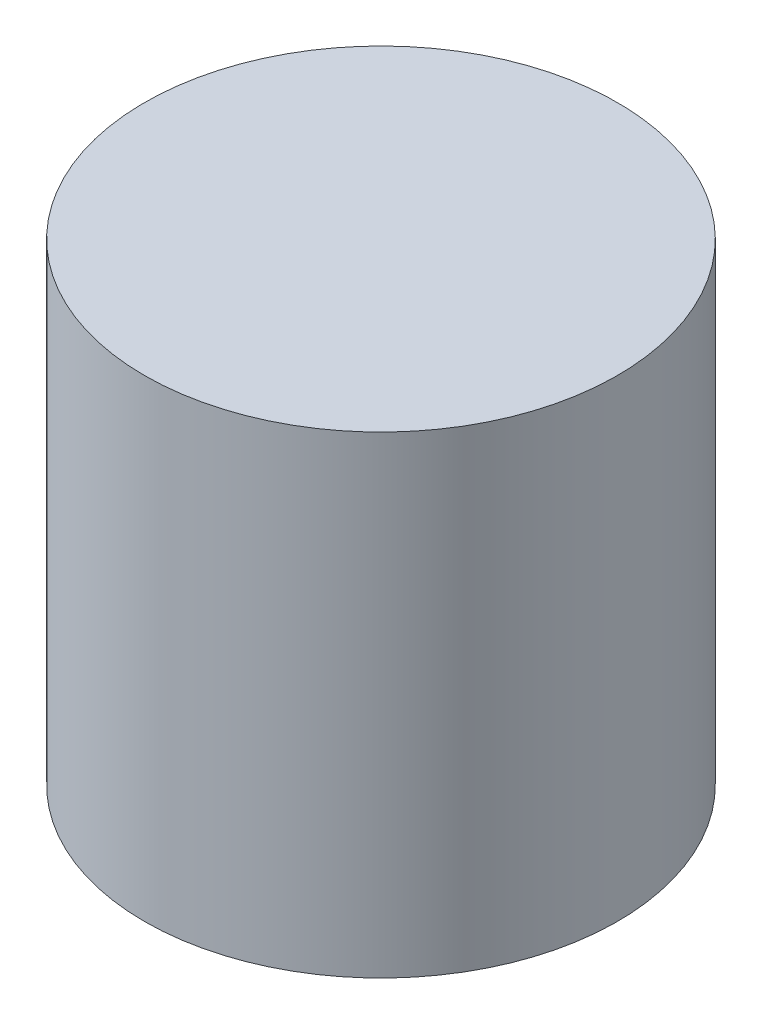
ISO-10303-21;
HEADER;
FILE_DESCRIPTION(('STEP AP214'),'2;1');
FILE_NAME('part.step','',(''),(''),'','','');
FILE_SCHEMA(('AUTOMOTIVE_DESIGN { 1 0 10303 214 1 1 1 1 }'));
ENDSEC;
DATA;
#1=APPLICATION_CONTEXT('core data for automotive mechanical design processes');
#2=APPLICATION_PROTOCOL_DEFINITION('international standard','automotive_design',2000,#1);
#3=PRODUCT_CONTEXT('',#1,'mechanical');
#4=PRODUCT('Part','Part','',(#3));
#5=PRODUCT_RELATED_PRODUCT_CATEGORY('part','',(#4));
#6=PRODUCT_DEFINITION_FORMATION('','',#4);
#7=PRODUCT_DEFINITION_CONTEXT('part definition',#1,'design');
#8=PRODUCT_DEFINITION('design','',#6,#7);
#9=PRODUCT_DEFINITION_SHAPE('','',#8);
#10=(LENGTH_UNIT() NAMED_UNIT(*) SI_UNIT(.MILLI.,.METRE.));
#11=(NAMED_UNIT(*) PLANE_ANGLE_UNIT() SI_UNIT($,.RADIAN.));
#12=(NAMED_UNIT(*) SI_UNIT($,.STERADIAN.) SOLID_ANGLE_UNIT());
#13=UNCERTAINTY_MEASURE_WITH_UNIT(LENGTH_MEASURE(1.E-05),#10,'distance_accuracy_value','');
#14=(GEOMETRIC_REPRESENTATION_CONTEXT(3) GLOBAL_UNCERTAINTY_ASSIGNED_CONTEXT((#13)) GLOBAL_UNIT_ASSIGNED_CONTEXT((#10,
#11,#12)) REPRESENTATION_CONTEXT('',''));
#15=CARTESIAN_POINT('',(0.,0.,0.));
#16=DIRECTION('',(0.,0.,1.));
#17=DIRECTION('',(1.,0.,0.));
#18=AXIS2_PLACEMENT_3D('',#15,#16,#17);
#19=CARTESIAN_POINT('',(0.,7.,0.));
#20=DIRECTION('',(0.,-1.,0.));
#21=DIRECTION('',(0.,0.,-1.));
#22=AXIS2_PLACEMENT_3D('',#19,#20,#21);
#23=CYLINDRICAL_SURFACE('',#22,3.5);
#24=CARTESIAN_POINT('',(0.,7.,0.));
#25=DIRECTION('',(0.,1.,0.));
#26=DIRECTION('',(0.,0.,1.));
#27=AXIS2_PLACEMENT_3D('',#24,#25,#26);
#28=CIRCLE('',#27,3.5);
#29=CARTESIAN_POINT('',(0.,7.,3.5));
#30=VERTEX_POINT('',#29);
#31=EDGE_CURVE('E10',#30,#30,#28,.T.);
#32=ORIENTED_EDGE('',*,*,#31,.F.);
#33=EDGE_LOOP('',(#32));
#34=FACE_BOUND('',#33,.T.);
#35=CARTESIAN_POINT('',(0.,0.,0.));
#36=DIRECTION('',(0.,1.,0.));
#37=DIRECTION('',(0.,0.,1.));
#38=AXIS2_PLACEMENT_3D('',#35,#36,#37);
#39=CIRCLE('',#38,3.5);
#40=CARTESIAN_POINT('',(0.,0.,3.5));
#41=VERTEX_POINT('',#40);
#42=EDGE_CURVE('E46',#41,#41,#39,.T.);
#43=ORIENTED_EDGE('',*,*,#42,.T.);
#44=EDGE_LOOP('',(#43));
#45=FACE_BOUND('',#44,.T.);
#46=ADVANCED_FACE('F43',(#34,#45),#23,.T.);
#47=CARTESIAN_POINT('',(0.,7.,0.));
#48=DIRECTION('',(0.,1.,0.));
#49=DIRECTION('',(0.,0.,1.));
#50=AXIS2_PLACEMENT_3D('',#47,#48,#49);
#51=PLANE('',#50);
#52=ORIENTED_EDGE('',*,*,#31,.T.);
#53=EDGE_LOOP('',(#52));
#54=FACE_BOUND('',#53,.T.);
#55=ADVANCED_FACE('F60',(#54),#51,.T.);
#56=CARTESIAN_POINT('',(0.,0.,0.));
#57=DIRECTION('',(0.,1.,0.));
#58=DIRECTION('',(0.,0.,1.));
#59=AXIS2_PLACEMENT_3D('',#56,#57,#58);
#60=PLANE('',#59);
#61=ORIENTED_EDGE('',*,*,#42,.F.);
#62=EDGE_LOOP('',(#61));
#63=FACE_BOUND('',#62,.T.);
#64=ADVANCED_FACE('F58',(#63),#60,.F.);
#65=CLOSED_SHELL('',(#46,#55,#64));
#66=MANIFOLD_SOLID_BREP('B2',#65);
#67=ADVANCED_BREP_SHAPE_REPRESENTATION('',(#18,#66),#14);
#68=SHAPE_DEFINITION_REPRESENTATION(#9,#67);
ENDSEC;
END-ISO-10303-21;
